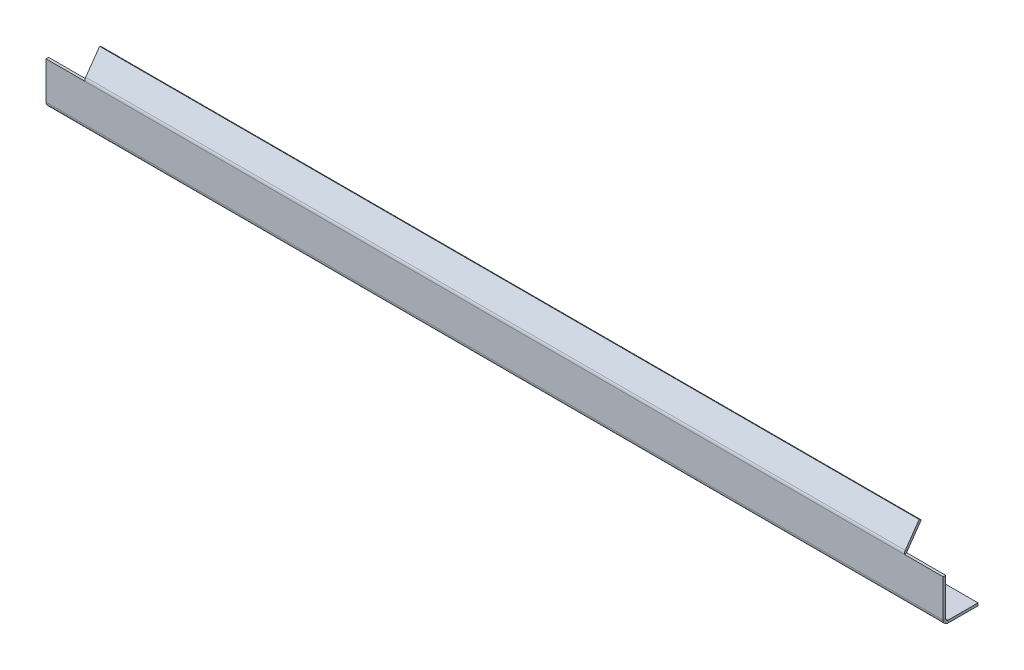
ISO-10303-21;
HEADER;
FILE_DESCRIPTION(('STEP AP214'),'2;1');
FILE_NAME('part.step','',(''),(''),'','','');
FILE_SCHEMA(('AUTOMOTIVE_DESIGN { 1 0 10303 214 1 1 1 1 }'));
ENDSEC;
DATA;
#1=APPLICATION_CONTEXT('core data for automotive mechanical design processes');
#2=APPLICATION_PROTOCOL_DEFINITION('international standard','automotive_design',2000,#1);
#3=PRODUCT_CONTEXT('',#1,'mechanical');
#4=PRODUCT('Part','Part','',(#3));
#5=PRODUCT_RELATED_PRODUCT_CATEGORY('part','',(#4));
#6=PRODUCT_DEFINITION_FORMATION('','',#4);
#7=PRODUCT_DEFINITION_CONTEXT('part definition',#1,'design');
#8=PRODUCT_DEFINITION('design','',#6,#7);
#9=PRODUCT_DEFINITION_SHAPE('','',#8);
#10=(LENGTH_UNIT() NAMED_UNIT(*) SI_UNIT(.MILLI.,.METRE.));
#11=(NAMED_UNIT(*) PLANE_ANGLE_UNIT() SI_UNIT($,.RADIAN.));
#12=(NAMED_UNIT(*) SI_UNIT($,.STERADIAN.) SOLID_ANGLE_UNIT());
#13=UNCERTAINTY_MEASURE_WITH_UNIT(LENGTH_MEASURE(1.E-05),#10,'distance_accuracy_value','');
#14=(GEOMETRIC_REPRESENTATION_CONTEXT(3) GLOBAL_UNCERTAINTY_ASSIGNED_CONTEXT((#13)) GLOBAL_UNIT_ASSIGNED_CONTEXT((#10,
#11,#12)) REPRESENTATION_CONTEXT('',''));
#15=CARTESIAN_POINT('',(0.,0.,0.));
#16=DIRECTION('',(0.,0.,1.));
#17=DIRECTION('',(1.,0.,0.));
#18=AXIS2_PLACEMENT_3D('',#15,#16,#17);
#19=CARTESIAN_POINT('',(-347.,16.5,2.));
#20=DIRECTION('',(0.,-1.,0.));
#21=DIRECTION('',(0.,0.,-1.));
#22=AXIS2_PLACEMENT_3D('',#19,#20,#21);
#23=PLANE('',#22);
#24=DIRECTION('',(0.,0.,1.));
#25=VECTOR('',#24,1.);
#26=CARTESIAN_POINT('',(-317.,16.5,0.));
#27=LINE('',#26,#25);
#28=CARTESIAN_POINT('',(-317.,16.5,0.));
#29=VERTEX_POINT('',#28);
#30=CARTESIAN_POINT('',(-317.,16.5,1.99999999999996));
#31=VERTEX_POINT('',#30);
#32=EDGE_CURVE('E241',#29,#31,#27,.T.);
#33=ORIENTED_EDGE('',*,*,#32,.F.);
#34=DIRECTION('',(-1.,0.,0.));
#35=VECTOR('',#34,1.);
#36=CARTESIAN_POINT('',(-347.,16.5,0.));
#37=LINE('',#36,#35);
#38=CARTESIAN_POINT('',(-347.,16.5,0.));
#39=VERTEX_POINT('',#38);
#40=EDGE_CURVE('E312',#29,#39,#37,.T.);
#41=ORIENTED_EDGE('',*,*,#40,.T.);
#42=DIRECTION('',(0.,0.,-1.));
#43=VECTOR('',#42,1.);
#44=CARTESIAN_POINT('',(-347.,16.5,2.));
#45=LINE('',#44,#43);
#46=CARTESIAN_POINT('',(-347.,16.5,2.));
#47=VERTEX_POINT('',#46);
#48=EDGE_CURVE('E88',#47,#39,#45,.T.);
#49=ORIENTED_EDGE('',*,*,#48,.F.);
#50=DIRECTION('',(-1.,0.,0.));
#51=VECTOR('',#50,1.);
#52=CARTESIAN_POINT('',(-347.,16.5,2.));
#53=LINE('',#52,#51);
#54=EDGE_CURVE('E302',#31,#47,#53,.T.);
#55=ORIENTED_EDGE('',*,*,#54,.F.);
#56=EDGE_LOOP('',(#33,#41,#49,#55));
#57=FACE_BOUND('',#56,.T.);
#58=ADVANCED_FACE('F80',(#57),#23,.F.);
#59=CARTESIAN_POINT('',(347.,16.5,2.));
#60=DIRECTION('',(-1.,0.,0.));
#61=DIRECTION('',(0.,0.,1.));
#62=AXIS2_PLACEMENT_3D('',#59,#60,#61);
#63=PLANE('',#62);
#64=DIRECTION('',(0.,0.,1.));
#65=VECTOR('',#64,1.);
#66=CARTESIAN_POINT('',(347.,-12.5,1.23165366794353E-13));
#67=LINE('',#66,#65);
#68=CARTESIAN_POINT('',(347.,-12.5,1.23165366794353E-13));
#69=VERTEX_POINT('',#68);
#70=CARTESIAN_POINT('',(347.,-12.5,2.));
#71=VERTEX_POINT('',#70);
#72=EDGE_CURVE('E295',#69,#71,#67,.T.);
#73=ORIENTED_EDGE('',*,*,#72,.F.);
#74=DIRECTION('',(0.,1.,0.));
#75=VECTOR('',#74,1.);
#76=CARTESIAN_POINT('',(347.,16.5,0.));
#77=LINE('',#76,#75);
#78=CARTESIAN_POINT('',(347.,16.5,0.));
#79=VERTEX_POINT('',#78);
#80=EDGE_CURVE('E297',#69,#79,#77,.T.);
#81=ORIENTED_EDGE('',*,*,#80,.T.);
#82=DIRECTION('',(0.,0.,-1.));
#83=VECTOR('',#82,1.);
#84=CARTESIAN_POINT('',(347.,16.5,2.));
#85=LINE('',#84,#83);
#86=CARTESIAN_POINT('',(347.,16.5,2.));
#87=VERTEX_POINT('',#86);
#88=EDGE_CURVE('E13',#87,#79,#85,.T.);
#89=ORIENTED_EDGE('',*,*,#88,.F.);
#90=DIRECTION('',(0.,1.,0.));
#91=VECTOR('',#90,1.);
#92=CARTESIAN_POINT('',(347.,16.5,2.));
#93=LINE('',#92,#91);
#94=EDGE_CURVE('E300',#71,#87,#93,.T.);
#95=ORIENTED_EDGE('',*,*,#94,.F.);
#96=EDGE_LOOP('',(#73,#81,#89,#95));
#97=FACE_BOUND('',#96,.T.);
#98=ADVANCED_FACE('F82',(#97),#63,.F.);
#99=CARTESIAN_POINT('',(-347.,16.5,2.));
#100=DIRECTION('',(1.,0.,0.));
#101=DIRECTION('',(0.,0.,-1.));
#102=AXIS2_PLACEMENT_3D('',#99,#100,#101);
#103=PLANE('',#102);
#104=DIRECTION('',(0.,0.,1.));
#105=VECTOR('',#104,1.);
#106=CARTESIAN_POINT('',(-347.,-12.5,1.23165366794353E-13));
#107=LINE('',#106,#105);
#108=CARTESIAN_POINT('',(-347.,-12.5,1.23165366794353E-13));
#109=VERTEX_POINT('',#108);
#110=CARTESIAN_POINT('',(-347.,-12.5,2.00000000000012));
#111=VERTEX_POINT('',#110);
#112=EDGE_CURVE('E285',#109,#111,#107,.T.);
#113=ORIENTED_EDGE('',*,*,#112,.T.);
#114=DIRECTION('',(0.,-1.,0.));
#115=VECTOR('',#114,1.);
#116=CARTESIAN_POINT('',(-347.,16.5,2.));
#117=LINE('',#116,#115);
#118=EDGE_CURVE('E307',#47,#111,#117,.T.);
#119=ORIENTED_EDGE('',*,*,#118,.F.);
#120=ORIENTED_EDGE('',*,*,#48,.T.);
#121=DIRECTION('',(0.,-1.,0.));
#122=VECTOR('',#121,1.);
#123=CARTESIAN_POINT('',(-347.,16.5,0.));
#124=LINE('',#123,#122);
#125=EDGE_CURVE('E303',#39,#109,#124,.T.);
#126=ORIENTED_EDGE('',*,*,#125,.T.);
#127=EDGE_LOOP('',(#113,#119,#120,#126));
#128=FACE_BOUND('',#127,.T.);
#129=ADVANCED_FACE('F323',(#128),#103,.F.);
#130=CARTESIAN_POINT('',(347.,-16.5,2.));
#131=DIRECTION('',(0.,0.,1.));
#132=DIRECTION('',(1.,0.,0.));
#133=AXIS2_PLACEMENT_3D('',#130,#131,#132);
#134=PLANE('',#133);
#135=ORIENTED_EDGE('',*,*,#118,.T.);
#136=DIRECTION('',(-1.,0.,0.));
#137=VECTOR('',#136,1.);
#138=CARTESIAN_POINT('',(-347.,-12.5,2.00000000000012));
#139=LINE('',#138,#137);
#140=EDGE_CURVE('E280',#111,#71,#139,.F.);
#141=ORIENTED_EDGE('',*,*,#140,.T.);
#142=ORIENTED_EDGE('',*,*,#94,.T.);
#143=CARTESIAN_POINT('',(317.,16.5,2.));
#144=VERTEX_POINT('',#143);
#145=EDGE_CURVE('E304',#87,#144,#53,.T.);
#146=ORIENTED_EDGE('',*,*,#145,.T.);
#147=DIRECTION('',(1.,0.,0.));
#148=VECTOR('',#147,1.);
#149=CARTESIAN_POINT('',(317.,16.5,2.0000000000003));
#150=LINE('',#149,#148);
#151=EDGE_CURVE('E185',#144,#31,#150,.F.);
#152=ORIENTED_EDGE('',*,*,#151,.T.);
#153=ORIENTED_EDGE('',*,*,#54,.T.);
#154=EDGE_LOOP('',(#135,#141,#142,#146,#152,#153));
#155=FACE_BOUND('',#154,.T.);
#156=ADVANCED_FACE('F362',(#155),#134,.T.);
#157=CARTESIAN_POINT('',(347.,-16.5,0.));
#158=DIRECTION('',(0.,0.,1.));
#159=DIRECTION('',(1.,0.,0.));
#160=AXIS2_PLACEMENT_3D('',#157,#158,#159);
#161=PLANE('',#160);
#162=DIRECTION('',(-1.,0.,0.));
#163=VECTOR('',#162,1.);
#164=CARTESIAN_POINT('',(-347.,-12.5,1.23165366794353E-13));
#165=LINE('',#164,#163);
#166=EDGE_CURVE('E291',#109,#69,#165,.F.);
#167=ORIENTED_EDGE('',*,*,#166,.F.);
#168=ORIENTED_EDGE('',*,*,#125,.F.);
#169=ORIENTED_EDGE('',*,*,#40,.F.);
#170=DIRECTION('',(1.,0.,0.));
#171=VECTOR('',#170,1.);
#172=CARTESIAN_POINT('',(317.,16.5,2.95336671785051E-13));
#173=LINE('',#172,#171);
#174=CARTESIAN_POINT('',(317.,16.5,2.95336671785051E-13));
#175=VERTEX_POINT('',#174);
#176=EDGE_CURVE('E238',#175,#29,#173,.F.);
#177=ORIENTED_EDGE('',*,*,#176,.F.);
#178=EDGE_CURVE('E313',#79,#175,#37,.T.);
#179=ORIENTED_EDGE('',*,*,#178,.F.);
#180=ORIENTED_EDGE('',*,*,#80,.F.);
#181=EDGE_LOOP('',(#167,#168,#169,#177,#179,#180));
#182=FACE_BOUND('',#181,.T.);
#183=ADVANCED_FACE('F329',(#182),#161,.F.);
#184=ORIENTED_EDGE('',*,*,#178,.T.);
#185=DIRECTION('',(0.,0.,1.));
#186=VECTOR('',#185,1.);
#187=CARTESIAN_POINT('',(317.,16.5,2.95336671785051E-13));
#188=LINE('',#187,#186);
#189=EDGE_CURVE('E234',#175,#144,#188,.T.);
#190=ORIENTED_EDGE('',*,*,#189,.T.);
#191=ORIENTED_EDGE('',*,*,#145,.F.);
#192=ORIENTED_EDGE('',*,*,#88,.T.);
#193=EDGE_LOOP('',(#184,#190,#191,#192));
#194=FACE_BOUND('',#193,.T.);
#195=ADVANCED_FACE('F389',(#194),#23,.F.);
#196=CARTESIAN_POINT('',(347.,-12.5,-1.99999999999988));
#197=DIRECTION('',(1.,0.,0.));
#198=DIRECTION('',(0.,0.,-1.));
#199=AXIS2_PLACEMENT_3D('',#196,#197,#198);
#200=PLANE('',#199);
#201=DIRECTION('',(0.,-1.,0.));
#202=VECTOR('',#201,1.);
#203=CARTESIAN_POINT('',(347.,-16.5,-1.99999999999987));
#204=LINE('',#203,#202);
#205=CARTESIAN_POINT('',(347.,-14.5,-1.99999999999987));
#206=VERTEX_POINT('',#205);
#207=CARTESIAN_POINT('',(347.,-16.5,-1.99999999999986));
#208=VERTEX_POINT('',#207);
#209=EDGE_CURVE('E243',#206,#208,#204,.T.);
#210=ORIENTED_EDGE('',*,*,#209,.F.);
#211=CARTESIAN_POINT('',(347.,-12.5,-1.99999999999988));
#212=DIRECTION('',(-1.,0.,0.));
#213=DIRECTION('',(0.,0.,1.));
#214=AXIS2_PLACEMENT_3D('',#211,#212,#213);
#215=CIRCLE('',#214,2.);
#216=EDGE_CURVE('E288',#69,#206,#215,.F.);
#217=ORIENTED_EDGE('',*,*,#216,.F.);
#218=ORIENTED_EDGE('',*,*,#72,.T.);
#219=CARTESIAN_POINT('',(347.,-12.5,-1.99999999999988));
#220=DIRECTION('',(-1.,0.,0.));
#221=DIRECTION('',(0.,0.,1.));
#222=AXIS2_PLACEMENT_3D('',#219,#220,#221);
#223=CIRCLE('',#222,4.);
#224=EDGE_CURVE('E103',#71,#208,#223,.F.);
#225=ORIENTED_EDGE('',*,*,#224,.T.);
#226=EDGE_LOOP('',(#210,#217,#218,#225));
#227=FACE_BOUND('',#226,.T.);
#228=ADVANCED_FACE('F340',(#227),#200,.T.);
#229=CARTESIAN_POINT('',(-347.,-12.5,-1.99999999999988));
#230=DIRECTION('',(1.,0.,0.));
#231=DIRECTION('',(0.,0.,-1.));
#232=AXIS2_PLACEMENT_3D('',#229,#230,#231);
#233=PLANE('',#232);
#234=CARTESIAN_POINT('',(-347.,-12.5,-1.99999999999988));
#235=DIRECTION('',(-1.,0.,0.));
#236=DIRECTION('',(0.,0.,1.));
#237=AXIS2_PLACEMENT_3D('',#234,#235,#236);
#238=CIRCLE('',#237,2.);
#239=CARTESIAN_POINT('',(-347.,-14.5,-1.99999999999987));
#240=VERTEX_POINT('',#239);
#241=EDGE_CURVE('E247',#240,#109,#238,.T.);
#242=ORIENTED_EDGE('',*,*,#241,.F.);
#243=DIRECTION('',(0.,-1.,0.));
#244=VECTOR('',#243,1.);
#245=CARTESIAN_POINT('',(-347.,-14.5,-1.99999999999986));
#246=LINE('',#245,#244);
#247=CARTESIAN_POINT('',(-347.,-16.5,-1.99999999999985));
#248=VERTEX_POINT('',#247);
#249=EDGE_CURVE('E273',#240,#248,#246,.T.);
#250=ORIENTED_EDGE('',*,*,#249,.T.);
#251=CARTESIAN_POINT('',(-347.,-12.5,-1.99999999999988));
#252=DIRECTION('',(-1.,0.,0.));
#253=DIRECTION('',(0.,0.,1.));
#254=AXIS2_PLACEMENT_3D('',#251,#252,#253);
#255=CIRCLE('',#254,4.);
#256=EDGE_CURVE('E283',#248,#111,#255,.T.);
#257=ORIENTED_EDGE('',*,*,#256,.T.);
#258=ORIENTED_EDGE('',*,*,#112,.F.);
#259=EDGE_LOOP('',(#242,#250,#257,#258));
#260=FACE_BOUND('',#259,.T.);
#261=ADVANCED_FACE('F360',(#260),#233,.F.);
#262=CARTESIAN_POINT('',(-347.,-12.5,-1.99999999999988));
#263=DIRECTION('',(-1.,0.,0.));
#264=DIRECTION('',(0.,-1.,0.));
#265=AXIS2_PLACEMENT_3D('',#262,#263,#264);
#266=CYLINDRICAL_SURFACE('',#265,4.);
#267=ORIENTED_EDGE('',*,*,#140,.F.);
#268=ORIENTED_EDGE('',*,*,#256,.F.);
#269=DIRECTION('',(-1.,0.,0.));
#270=VECTOR('',#269,1.);
#271=CARTESIAN_POINT('',(-347.,-16.5,-1.99999999999985));
#272=LINE('',#271,#270);
#273=EDGE_CURVE('E270',#208,#248,#272,.T.);
#274=ORIENTED_EDGE('',*,*,#273,.F.);
#275=ORIENTED_EDGE('',*,*,#224,.F.);
#276=EDGE_LOOP('',(#267,#268,#274,#275));
#277=FACE_BOUND('',#276,.T.);
#278=ADVANCED_FACE('F574',(#277),#266,.T.);
#279=CARTESIAN_POINT('',(-347.,-12.5,-1.99999999999988));
#280=DIRECTION('',(-1.,0.,0.));
#281=DIRECTION('',(0.,-1.,0.));
#282=AXIS2_PLACEMENT_3D('',#279,#280,#281);
#283=CYLINDRICAL_SURFACE('',#282,2.);
#284=ORIENTED_EDGE('',*,*,#166,.T.);
#285=ORIENTED_EDGE('',*,*,#216,.T.);
#286=DIRECTION('',(1.,0.,0.));
#287=VECTOR('',#286,1.);
#288=CARTESIAN_POINT('',(347.,-14.5,-1.99999999999988));
#289=LINE('',#288,#287);
#290=EDGE_CURVE('E276',#206,#240,#289,.F.);
#291=ORIENTED_EDGE('',*,*,#290,.T.);
#292=ORIENTED_EDGE('',*,*,#241,.T.);
#293=EDGE_LOOP('',(#284,#285,#291,#292));
#294=FACE_BOUND('',#293,.T.);
#295=ADVANCED_FACE('F336',(#294),#283,.F.);
#296=CARTESIAN_POINT('',(-347.,-16.5,1.2220184685951E-13));
#297=DIRECTION('',(-1.,0.,0.));
#298=DIRECTION('',(0.,0.,1.));
#299=AXIS2_PLACEMENT_3D('',#296,#297,#298);
#300=PLANE('',#299);
#301=DIRECTION('',(0.,0.,1.));
#302=VECTOR('',#301,1.);
#303=CARTESIAN_POINT('',(-347.,-16.5,1.2220184685951E-13));
#304=LINE('',#303,#302);
#305=CARTESIAN_POINT('',(-347.,-16.5000000000001,-25.));
#306=VERTEX_POINT('',#305);
#307=EDGE_CURVE('E251',#306,#248,#304,.T.);
#308=ORIENTED_EDGE('',*,*,#307,.T.);
#309=ORIENTED_EDGE('',*,*,#249,.F.);
#310=DIRECTION('',(0.,0.,-1.));
#311=VECTOR('',#310,1.);
#312=CARTESIAN_POINT('',(-347.,-14.5,1.15218884181823E-13));
#313=LINE('',#312,#311);
#314=CARTESIAN_POINT('',(-347.,-14.5000000000001,-25.));
#315=VERTEX_POINT('',#314);
#316=EDGE_CURVE('E260',#315,#240,#313,.F.);
#317=ORIENTED_EDGE('',*,*,#316,.F.);
#318=DIRECTION('',(0.,1.,0.));
#319=VECTOR('',#318,1.);
#320=CARTESIAN_POINT('',(-347.,-16.5000000000001,-25.));
#321=LINE('',#320,#319);
#322=EDGE_CURVE('E245',#306,#315,#321,.T.);
#323=ORIENTED_EDGE('',*,*,#322,.F.);
#324=EDGE_LOOP('',(#308,#309,#317,#323));
#325=FACE_BOUND('',#324,.T.);
#326=ADVANCED_FACE('F358',(#325),#300,.T.);
#327=CARTESIAN_POINT('',(347.,-16.5000000000001,-25.));
#328=DIRECTION('',(1.,0.,0.));
#329=DIRECTION('',(0.,0.,-1.));
#330=AXIS2_PLACEMENT_3D('',#327,#328,#329);
#331=PLANE('',#330);
#332=DIRECTION('',(0.,0.,1.));
#333=VECTOR('',#332,1.);
#334=CARTESIAN_POINT('',(347.,-14.5,1.15218884181823E-13));
#335=LINE('',#334,#333);
#336=CARTESIAN_POINT('',(347.,-14.5000000000001,-25.));
#337=VERTEX_POINT('',#336);
#338=EDGE_CURVE('E268',#206,#337,#335,.F.);
#339=ORIENTED_EDGE('',*,*,#338,.F.);
#340=ORIENTED_EDGE('',*,*,#209,.T.);
#341=DIRECTION('',(0.,0.,-1.));
#342=VECTOR('',#341,1.);
#343=CARTESIAN_POINT('',(347.,-16.5000000000001,-25.));
#344=LINE('',#343,#342);
#345=CARTESIAN_POINT('',(347.,-16.5000000000001,-25.));
#346=VERTEX_POINT('',#345);
#347=EDGE_CURVE('E258',#208,#346,#344,.T.);
#348=ORIENTED_EDGE('',*,*,#347,.T.);
#349=DIRECTION('',(0.,1.,0.));
#350=VECTOR('',#349,1.);
#351=CARTESIAN_POINT('',(347.,-16.5000000000001,-25.));
#352=LINE('',#351,#350);
#353=EDGE_CURVE('E248',#346,#337,#352,.T.);
#354=ORIENTED_EDGE('',*,*,#353,.T.);
#355=EDGE_LOOP('',(#339,#340,#348,#354));
#356=FACE_BOUND('',#355,.T.);
#357=ADVANCED_FACE('F344',(#356),#331,.T.);
#358=CARTESIAN_POINT('',(-347.,-16.5,1.2220184685951E-13));
#359=DIRECTION('',(0.,-1.,0.));
#360=DIRECTION('',(0.,0.,-1.));
#361=AXIS2_PLACEMENT_3D('',#358,#359,#360);
#362=PLANE('',#361);
#363=ORIENTED_EDGE('',*,*,#347,.F.);
#364=ORIENTED_EDGE('',*,*,#273,.T.);
#365=ORIENTED_EDGE('',*,*,#307,.F.);
#366=DIRECTION('',(-1.,0.,0.));
#367=VECTOR('',#366,1.);
#368=CARTESIAN_POINT('',(-347.,-16.5000000000001,-25.));
#369=LINE('',#368,#367);
#370=EDGE_CURVE('E255',#346,#306,#369,.T.);
#371=ORIENTED_EDGE('',*,*,#370,.F.);
#372=EDGE_LOOP('',(#363,#364,#365,#371));
#373=FACE_BOUND('',#372,.T.);
#374=ADVANCED_FACE('F348',(#373),#362,.T.);
#375=CARTESIAN_POINT('',(-347.,-14.5,1.15218884181823E-13));
#376=DIRECTION('',(0.,-1.,0.));
#377=DIRECTION('',(0.,0.,-1.));
#378=AXIS2_PLACEMENT_3D('',#375,#376,#377);
#379=PLANE('',#378);
#380=ORIENTED_EDGE('',*,*,#290,.F.);
#381=ORIENTED_EDGE('',*,*,#338,.T.);
#382=DIRECTION('',(1.,0.,0.));
#383=VECTOR('',#382,1.);
#384=CARTESIAN_POINT('',(-347.,-14.5000000000001,-25.));
#385=LINE('',#384,#383);
#386=EDGE_CURVE('E264',#337,#315,#385,.F.);
#387=ORIENTED_EDGE('',*,*,#386,.T.);
#388=ORIENTED_EDGE('',*,*,#316,.T.);
#389=EDGE_LOOP('',(#380,#381,#387,#388));
#390=FACE_BOUND('',#389,.T.);
#391=ADVANCED_FACE('F355',(#390),#379,.F.);
#392=CARTESIAN_POINT('',(-347.,-16.5000000000001,-25.));
#393=DIRECTION('',(0.,0.,-1.));
#394=DIRECTION('',(0.,1.,0.));
#395=AXIS2_PLACEMENT_3D('',#392,#393,#394);
#396=PLANE('',#395);
#397=ORIENTED_EDGE('',*,*,#386,.F.);
#398=ORIENTED_EDGE('',*,*,#353,.F.);
#399=ORIENTED_EDGE('',*,*,#370,.T.);
#400=ORIENTED_EDGE('',*,*,#322,.T.);
#401=EDGE_LOOP('',(#397,#398,#399,#400));
#402=FACE_BOUND('',#401,.T.);
#403=ADVANCED_FACE('F352',(#402),#396,.T.);
#404=CARTESIAN_POINT('',(-317.,16.5,-2.00000000000013));
#405=DIRECTION('',(-1.,0.,0.));
#406=DIRECTION('',(0.,0.,1.));
#407=AXIS2_PLACEMENT_3D('',#404,#405,#406);
#408=PLANE('',#407);
#409=DIRECTION('',(0.,0.573576436351042,0.819152044288995));
#410=VECTOR('',#409,1.);
#411=CARTESIAN_POINT('',(-317.,18.7943057454042,1.27660817715594));
#412=LINE('',#411,#410);
#413=CARTESIAN_POINT('',(-317.,17.6471528727022,-0.361695911422068));
#414=VERTEX_POINT('',#413);
#415=CARTESIAN_POINT('',(-317.,18.7943057454043,1.27660817715592));
#416=VERTEX_POINT('',#415);
#417=EDGE_CURVE('E229',#414,#416,#412,.T.);
#418=ORIENTED_EDGE('',*,*,#417,.F.);
#419=CARTESIAN_POINT('',(-317.,16.5,-2.00000000000013));
#420=DIRECTION('',(1.,0.,0.));
#421=DIRECTION('',(0.,0.,-1.));
#422=AXIS2_PLACEMENT_3D('',#419,#420,#421);
#423=CIRCLE('',#422,2.00000000000009);
#424=EDGE_CURVE('E187',#29,#414,#423,.F.);
#425=ORIENTED_EDGE('',*,*,#424,.F.);
#426=ORIENTED_EDGE('',*,*,#32,.T.);
#427=CARTESIAN_POINT('',(-317.,16.5,-2.00000000000013));
#428=DIRECTION('',(1.,0.,0.));
#429=DIRECTION('',(0.,0.,-1.));
#430=AXIS2_PLACEMENT_3D('',#427,#428,#429);
#431=CIRCLE('',#430,4.00000000000009);
#432=EDGE_CURVE('E233',#31,#416,#431,.F.);
#433=ORIENTED_EDGE('',*,*,#432,.T.);
#434=EDGE_LOOP('',(#418,#425,#426,#433));
#435=FACE_BOUND('',#434,.T.);
#436=ADVANCED_FACE('F367',(#435),#408,.T.);
#437=CARTESIAN_POINT('',(317.,16.5,-1.99999999999979));
#438=DIRECTION('',(-1.,0.,0.));
#439=DIRECTION('',(0.,0.,1.));
#440=AXIS2_PLACEMENT_3D('',#437,#438,#439);
#441=PLANE('',#440);
#442=CARTESIAN_POINT('',(317.,16.5,-1.99999999999979));
#443=DIRECTION('',(1.,0.,0.));
#444=DIRECTION('',(0.,0.,-1.));
#445=AXIS2_PLACEMENT_3D('',#442,#443,#444);
#446=CIRCLE('',#445,2.00000000000009);
#447=CARTESIAN_POINT('',(317.,17.6471528727022,-0.361695911421731));
#448=VERTEX_POINT('',#447);
#449=EDGE_CURVE('E194',#448,#175,#446,.T.);
#450=ORIENTED_EDGE('',*,*,#449,.F.);
#451=DIRECTION('',(0.,0.573576436351042,0.819152044288995));
#452=VECTOR('',#451,1.);
#453=CARTESIAN_POINT('',(317.,17.647152872702,-0.361695911421968));
#454=LINE('',#453,#452);
#455=CARTESIAN_POINT('',(317.,18.7943057454041,1.27660817715602));
#456=VERTEX_POINT('',#455);
#457=EDGE_CURVE('E191',#448,#456,#454,.T.);
#458=ORIENTED_EDGE('',*,*,#457,.T.);
#459=CARTESIAN_POINT('',(317.,16.5,-1.99999999999979));
#460=DIRECTION('',(1.,0.,0.));
#461=DIRECTION('',(0.,0.,-1.));
#462=AXIS2_PLACEMENT_3D('',#459,#460,#461);
#463=CIRCLE('',#462,4.00000000000009);
#464=EDGE_CURVE('E95',#456,#144,#463,.T.);
#465=ORIENTED_EDGE('',*,*,#464,.T.);
#466=ORIENTED_EDGE('',*,*,#189,.F.);
#467=EDGE_LOOP('',(#450,#458,#465,#466));
#468=FACE_BOUND('',#467,.T.);
#469=ADVANCED_FACE('F192',(#468),#441,.F.);
#470=CARTESIAN_POINT('',(317.,16.5,-1.99999999999979));
#471=DIRECTION('',(1.,0.,0.));
#472=DIRECTION('',(0.,0.573576436351042,0.819152044288995));
#473=AXIS2_PLACEMENT_3D('',#470,#471,#472);
#474=CYLINDRICAL_SURFACE('',#473,4.00000000000009);
#475=ORIENTED_EDGE('',*,*,#151,.F.);
#476=ORIENTED_EDGE('',*,*,#464,.F.);
#477=DIRECTION('',(1.,0.,0.));
#478=VECTOR('',#477,1.);
#479=CARTESIAN_POINT('',(0.,18.7943057454042,1.27660817715598));
#480=LINE('',#479,#478);
#481=EDGE_CURVE('E182',#416,#456,#480,.T.);
#482=ORIENTED_EDGE('',*,*,#481,.F.);
#483=ORIENTED_EDGE('',*,*,#432,.F.);
#484=EDGE_LOOP('',(#475,#476,#482,#483));
#485=FACE_BOUND('',#484,.T.);
#486=ADVANCED_FACE('F179',(#485),#474,.T.);
#487=CARTESIAN_POINT('',(317.,16.5,-1.99999999999979));
#488=DIRECTION('',(1.,0.,0.));
#489=DIRECTION('',(0.,0.573576436351042,0.819152044288995));
#490=AXIS2_PLACEMENT_3D('',#487,#488,#489);
#491=CYLINDRICAL_SURFACE('',#490,2.00000000000009);
#492=ORIENTED_EDGE('',*,*,#176,.T.);
#493=ORIENTED_EDGE('',*,*,#424,.T.);
#494=DIRECTION('',(-1.,0.,0.));
#495=VECTOR('',#494,1.);
#496=CARTESIAN_POINT('',(-317.,17.6471528727022,-0.361695911422054));
#497=LINE('',#496,#495);
#498=EDGE_CURVE('E199',#414,#448,#497,.F.);
#499=ORIENTED_EDGE('',*,*,#498,.T.);
#500=ORIENTED_EDGE('',*,*,#449,.T.);
#501=EDGE_LOOP('',(#492,#493,#499,#500));
#502=FACE_BOUND('',#501,.T.);
#503=ADVANCED_FACE('F370',(#502),#491,.F.);
#504=CARTESIAN_POINT('',(317.,18.27775045046,1.63830408857799));
#505=DIRECTION('',(1.,0.,0.));
#506=DIRECTION('',(0.,0.,-1.));
#507=AXIS2_PLACEMENT_3D('',#504,#505,#506);
#508=PLANE('',#507);
#509=DIRECTION('',(0.,-0.819152044288995,0.573576436351042));
#510=VECTOR('',#509,1.);
#511=CARTESIAN_POINT('',(317.,18.27775045046,1.63830408857799));
#512=LINE('',#511,#510);
#513=CARTESIAN_POINT('',(317.,34.1442360412958,-9.47152872702083));
#514=VERTEX_POINT('',#513);
#515=EDGE_CURVE('E206',#514,#456,#512,.T.);
#516=ORIENTED_EDGE('',*,*,#515,.T.);
#517=ORIENTED_EDGE('',*,*,#457,.F.);
#518=DIRECTION('',(0.,0.819152044288995,-0.573576436351042));
#519=VECTOR('',#518,1.);
#520=CARTESIAN_POINT('',(317.,6.05893139532111,7.75246412148371));
#521=LINE('',#520,#519);
#522=CARTESIAN_POINT('',(317.,32.9970831685937,-11.1098328155988));
#523=VERTEX_POINT('',#522);
#524=EDGE_CURVE('E222',#523,#448,#521,.F.);
#525=ORIENTED_EDGE('',*,*,#524,.F.);
#526=DIRECTION('',(0.,-0.573576436351042,-0.819152044288995));
#527=VECTOR('',#526,1.);
#528=CARTESIAN_POINT('',(317.,34.1442360412958,-9.47152872702083));
#529=LINE('',#528,#527);
#530=EDGE_CURVE('E211',#514,#523,#529,.T.);
#531=ORIENTED_EDGE('',*,*,#530,.F.);
#532=EDGE_LOOP('',(#516,#517,#525,#531));
#533=FACE_BOUND('',#532,.T.);
#534=ADVANCED_FACE('F210',(#533),#508,.T.);
#535=CARTESIAN_POINT('',(-317.,34.1442360412959,-9.47152872702087));
#536=DIRECTION('',(-1.,0.,0.));
#537=DIRECTION('',(0.,0.,1.));
#538=AXIS2_PLACEMENT_3D('',#535,#536,#537);
#539=PLANE('',#538);
#540=DIRECTION('',(0.,-0.819152044288995,0.573576436351042));
#541=VECTOR('',#540,1.);
#542=CARTESIAN_POINT('',(-317.,6.05893139532111,7.75246412148372));
#543=LINE('',#542,#541);
#544=CARTESIAN_POINT('',(-317.,32.9970831685938,-11.1098328155989));
#545=VERTEX_POINT('',#544);
#546=EDGE_CURVE('E208',#414,#545,#543,.F.);
#547=ORIENTED_EDGE('',*,*,#546,.F.);
#548=ORIENTED_EDGE('',*,*,#417,.T.);
#549=DIRECTION('',(0.,0.819152044288995,-0.573576436351042));
#550=VECTOR('',#549,1.);
#551=CARTESIAN_POINT('',(-317.,34.1442360412959,-9.47152872702087));
#552=LINE('',#551,#550);
#553=CARTESIAN_POINT('',(-317.,34.1442360412959,-9.47152872702087));
#554=VERTEX_POINT('',#553);
#555=EDGE_CURVE('E207',#416,#554,#552,.T.);
#556=ORIENTED_EDGE('',*,*,#555,.T.);
#557=DIRECTION('',(0.,-0.573576436351042,-0.819152044288995));
#558=VECTOR('',#557,1.);
#559=CARTESIAN_POINT('',(-317.,34.1442360412959,-9.47152872702087));
#560=LINE('',#559,#558);
#561=EDGE_CURVE('E213',#554,#545,#560,.T.);
#562=ORIENTED_EDGE('',*,*,#561,.T.);
#563=EDGE_LOOP('',(#547,#548,#556,#562));
#564=FACE_BOUND('',#563,.T.);
#565=ADVANCED_FACE('F375',(#564),#539,.T.);
#566=CARTESIAN_POINT('',(0.,7.20608426802319,9.3907682100617));
#567=DIRECTION('',(0.,0.573576436351042,0.819152044288995));
#568=DIRECTION('',(0.,-0.819152044288995,0.573576436351042));
#569=AXIS2_PLACEMENT_3D('',#566,#567,#568);
#570=PLANE('',#569);
#571=ORIENTED_EDGE('',*,*,#555,.F.);
#572=ORIENTED_EDGE('',*,*,#481,.T.);
#573=ORIENTED_EDGE('',*,*,#515,.F.);
#574=DIRECTION('',(1.,0.,0.));
#575=VECTOR('',#574,1.);
#576=CARTESIAN_POINT('',(317.,34.1442360412958,-9.47152872702083));
#577=LINE('',#576,#575);
#578=EDGE_CURVE('E214',#554,#514,#577,.T.);
#579=ORIENTED_EDGE('',*,*,#578,.F.);
#580=EDGE_LOOP('',(#571,#572,#573,#579));
#581=FACE_BOUND('',#580,.T.);
#582=ADVANCED_FACE('F204',(#581),#570,.T.);
#583=CARTESIAN_POINT('',(0.,6.05893139532111,7.75246412148371));
#584=DIRECTION('',(0.,0.573576436351042,0.819152044288995));
#585=DIRECTION('',(0.,-0.819152044288995,0.573576436351042));
#586=AXIS2_PLACEMENT_3D('',#583,#584,#585);
#587=PLANE('',#586);
#588=ORIENTED_EDGE('',*,*,#498,.F.);
#589=ORIENTED_EDGE('',*,*,#546,.T.);
#590=DIRECTION('',(-1.,0.,0.));
#591=VECTOR('',#590,1.);
#592=CARTESIAN_POINT('',(0.,32.9970831685938,-11.1098328155988));
#593=LINE('',#592,#591);
#594=EDGE_CURVE('E224',#545,#523,#593,.F.);
#595=ORIENTED_EDGE('',*,*,#594,.T.);
#596=ORIENTED_EDGE('',*,*,#524,.T.);
#597=EDGE_LOOP('',(#588,#589,#595,#596));
#598=FACE_BOUND('',#597,.T.);
#599=ADVANCED_FACE('F373',(#598),#587,.F.);
#600=CARTESIAN_POINT('',(317.,34.1442360412958,-9.47152872702083));
#601=DIRECTION('',(0.,0.819152044288995,-0.573576436351042));
#602=DIRECTION('',(0.,0.573576436351042,0.819152044288995));
#603=AXIS2_PLACEMENT_3D('',#600,#601,#602);
#604=PLANE('',#603);
#605=ORIENTED_EDGE('',*,*,#594,.F.);
#606=ORIENTED_EDGE('',*,*,#561,.F.);
#607=ORIENTED_EDGE('',*,*,#578,.T.);
#608=ORIENTED_EDGE('',*,*,#530,.T.);
#609=EDGE_LOOP('',(#605,#606,#607,#608));
#610=FACE_BOUND('',#609,.T.);
#611=ADVANCED_FACE('F379',(#610),#604,.T.);
#612=CLOSED_SHELL('',(#58,#98,#129,#156,#183,#195,#228,#261,#278,#295,#326,#357,#374,#391,#403,
#436,#469,#486,#503,#534,#565,#582,#599,#611));
#613=MANIFOLD_SOLID_BREP('B2',#612);
#614=ADVANCED_BREP_SHAPE_REPRESENTATION('',(#18,#613),#14);
#615=SHAPE_DEFINITION_REPRESENTATION(#9,#614);
ENDSEC;
END-ISO-10303-21;
